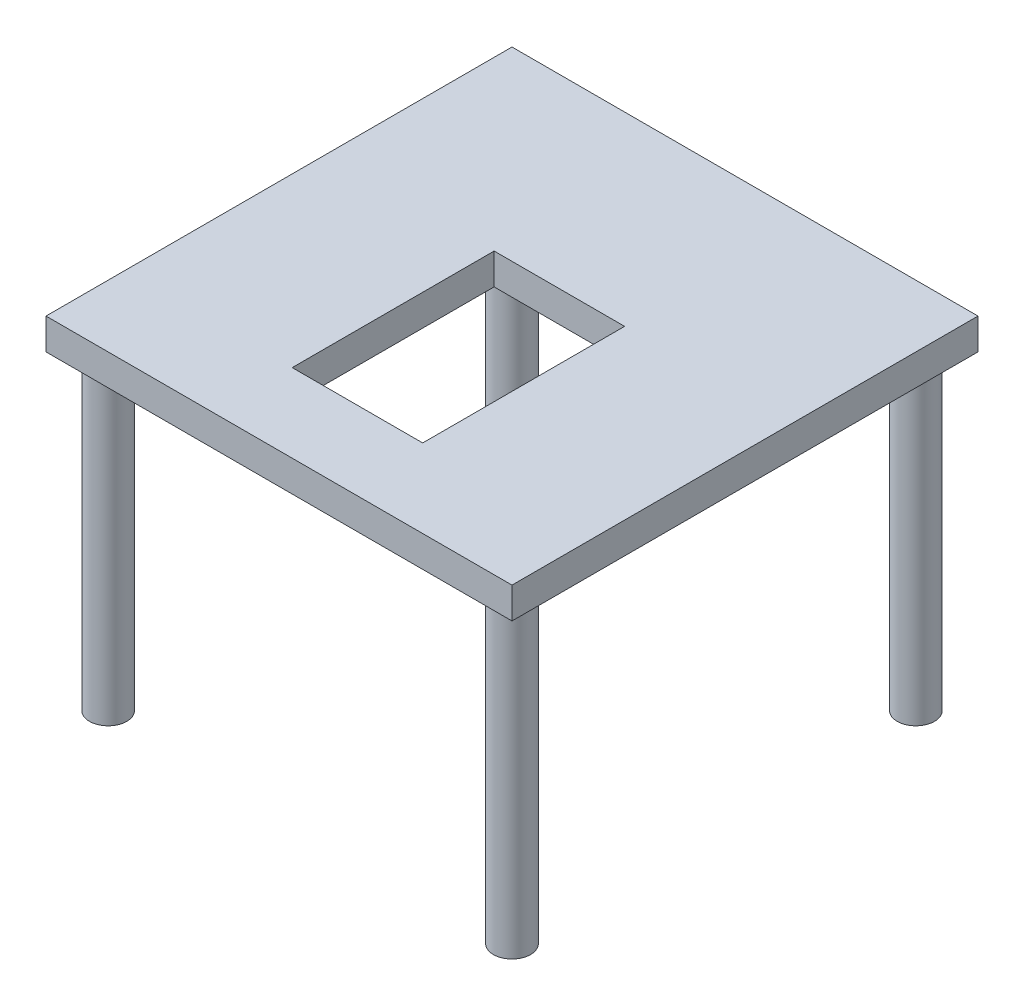
ISO-10303-21;
HEADER;
FILE_DESCRIPTION(('STEP AP214'),'2;1');
FILE_NAME('part.step','',(''),(''),'','','');
FILE_SCHEMA(('AUTOMOTIVE_DESIGN { 1 0 10303 214 1 1 1 1 }'));
ENDSEC;
DATA;
#1=APPLICATION_CONTEXT('core data for automotive mechanical design processes');
#2=APPLICATION_PROTOCOL_DEFINITION('international standard','automotive_design',2000,#1);
#3=PRODUCT_CONTEXT('',#1,'mechanical');
#4=PRODUCT('Part','Part','',(#3));
#5=PRODUCT_RELATED_PRODUCT_CATEGORY('part','',(#4));
#6=PRODUCT_DEFINITION_FORMATION('','',#4);
#7=PRODUCT_DEFINITION_CONTEXT('part definition',#1,'design');
#8=PRODUCT_DEFINITION('design','',#6,#7);
#9=PRODUCT_DEFINITION_SHAPE('','',#8);
#10=(LENGTH_UNIT() NAMED_UNIT(*) SI_UNIT(.MILLI.,.METRE.));
#11=(NAMED_UNIT(*) PLANE_ANGLE_UNIT() SI_UNIT($,.RADIAN.));
#12=(NAMED_UNIT(*) SI_UNIT($,.STERADIAN.) SOLID_ANGLE_UNIT());
#13=UNCERTAINTY_MEASURE_WITH_UNIT(LENGTH_MEASURE(1.E-05),#10,'distance_accuracy_value','');
#14=(GEOMETRIC_REPRESENTATION_CONTEXT(3) GLOBAL_UNCERTAINTY_ASSIGNED_CONTEXT((#13)) GLOBAL_UNIT_ASSIGNED_CONTEXT((#10,
#11,#12)) REPRESENTATION_CONTEXT('',''));
#15=CARTESIAN_POINT('',(0.,0.,0.));
#16=DIRECTION('',(0.,0.,1.));
#17=DIRECTION('',(1.,0.,0.));
#18=AXIS2_PLACEMENT_3D('',#15,#16,#17);
#19=CARTESIAN_POINT('',(0.,10.,75.));
#20=DIRECTION('',(0.,0.,-1.));
#21=DIRECTION('',(-1.,0.,0.));
#22=AXIS2_PLACEMENT_3D('',#19,#20,#21);
#23=PLANE('',#22);
#24=DIRECTION('',(1.,0.,0.));
#25=VECTOR('',#24,1.);
#26=CARTESIAN_POINT('',(0.,0.,75.));
#27=LINE('',#26,#25);
#28=CARTESIAN_POINT('',(-75.,0.,75.));
#29=VERTEX_POINT('',#28);
#30=CARTESIAN_POINT('',(75.,0.,75.));
#31=VERTEX_POINT('',#30);
#32=EDGE_CURVE('E150',#29,#31,#27,.T.);
#33=ORIENTED_EDGE('',*,*,#32,.T.);
#34=DIRECTION('',(0.,-1.,0.));
#35=VECTOR('',#34,1.);
#36=CARTESIAN_POINT('',(75.,10.,75.));
#37=LINE('',#36,#35);
#38=CARTESIAN_POINT('',(75.,10.,75.));
#39=VERTEX_POINT('',#38);
#40=EDGE_CURVE('E179',#39,#31,#37,.T.);
#41=ORIENTED_EDGE('',*,*,#40,.F.);
#42=DIRECTION('',(1.,0.,0.));
#43=VECTOR('',#42,1.);
#44=CARTESIAN_POINT('',(0.,10.,75.));
#45=LINE('',#44,#43);
#46=CARTESIAN_POINT('',(-75.,10.,75.));
#47=VERTEX_POINT('',#46);
#48=EDGE_CURVE('E151',#47,#39,#45,.T.);
#49=ORIENTED_EDGE('',*,*,#48,.F.);
#50=DIRECTION('',(0.,-1.,0.));
#51=VECTOR('',#50,1.);
#52=CARTESIAN_POINT('',(-75.,10.,75.));
#53=LINE('',#52,#51);
#54=EDGE_CURVE('E163',#47,#29,#53,.T.);
#55=ORIENTED_EDGE('',*,*,#54,.T.);
#56=EDGE_LOOP('',(#33,#41,#49,#55));
#57=FACE_BOUND('',#56,.T.);
#58=ADVANCED_FACE('F46',(#57),#23,.F.);
#59=CARTESIAN_POINT('',(75.,10.,0.));
#60=DIRECTION('',(-1.,0.,0.));
#61=DIRECTION('',(0.,0.,1.));
#62=AXIS2_PLACEMENT_3D('',#59,#60,#61);
#63=PLANE('',#62);
#64=DIRECTION('',(0.,0.,-1.));
#65=VECTOR('',#64,1.);
#66=CARTESIAN_POINT('',(75.,0.,0.));
#67=LINE('',#66,#65);
#68=CARTESIAN_POINT('',(75.,0.,-75.));
#69=VERTEX_POINT('',#68);
#70=EDGE_CURVE('E166',#31,#69,#67,.T.);
#71=ORIENTED_EDGE('',*,*,#70,.T.);
#72=DIRECTION('',(0.,-1.,0.));
#73=VECTOR('',#72,1.);
#74=CARTESIAN_POINT('',(75.,10.,-75.));
#75=LINE('',#74,#73);
#76=CARTESIAN_POINT('',(75.,10.,-75.));
#77=VERTEX_POINT('',#76);
#78=EDGE_CURVE('E177',#77,#69,#75,.T.);
#79=ORIENTED_EDGE('',*,*,#78,.F.);
#80=DIRECTION('',(0.,0.,-1.));
#81=VECTOR('',#80,1.);
#82=CARTESIAN_POINT('',(75.,10.,0.));
#83=LINE('',#82,#81);
#84=EDGE_CURVE('E154',#39,#77,#83,.T.);
#85=ORIENTED_EDGE('',*,*,#84,.F.);
#86=ORIENTED_EDGE('',*,*,#40,.T.);
#87=EDGE_LOOP('',(#71,#79,#85,#86));
#88=FACE_BOUND('',#87,.T.);
#89=ADVANCED_FACE('F217',(#88),#63,.F.);
#90=CARTESIAN_POINT('',(0.,10.,-75.));
#91=DIRECTION('',(0.,0.,-1.));
#92=DIRECTION('',(-1.,0.,0.));
#93=AXIS2_PLACEMENT_3D('',#90,#91,#92);
#94=PLANE('',#93);
#95=DIRECTION('',(1.,0.,0.));
#96=VECTOR('',#95,1.);
#97=CARTESIAN_POINT('',(0.,0.,-75.));
#98=LINE('',#97,#96);
#99=CARTESIAN_POINT('',(-75.,0.,-75.));
#100=VERTEX_POINT('',#99);
#101=EDGE_CURVE('E169',#100,#69,#98,.T.);
#102=ORIENTED_EDGE('',*,*,#101,.F.);
#103=DIRECTION('',(0.,-1.,0.));
#104=VECTOR('',#103,1.);
#105=CARTESIAN_POINT('',(-75.,10.,-75.));
#106=LINE('',#105,#104);
#107=CARTESIAN_POINT('',(-75.,10.,-75.));
#108=VERTEX_POINT('',#107);
#109=EDGE_CURVE('E175',#108,#100,#106,.T.);
#110=ORIENTED_EDGE('',*,*,#109,.F.);
#111=DIRECTION('',(1.,0.,0.));
#112=VECTOR('',#111,1.);
#113=CARTESIAN_POINT('',(0.,10.,-75.));
#114=LINE('',#113,#112);
#115=EDGE_CURVE('E157',#108,#77,#114,.T.);
#116=ORIENTED_EDGE('',*,*,#115,.T.);
#117=ORIENTED_EDGE('',*,*,#78,.T.);
#118=EDGE_LOOP('',(#102,#110,#116,#117));
#119=FACE_BOUND('',#118,.T.);
#120=ADVANCED_FACE('F222',(#119),#94,.T.);
#121=CARTESIAN_POINT('',(-75.,10.,0.));
#122=DIRECTION('',(-1.,0.,0.));
#123=DIRECTION('',(0.,0.,1.));
#124=AXIS2_PLACEMENT_3D('',#121,#122,#123);
#125=PLANE('',#124);
#126=DIRECTION('',(0.,0.,-1.));
#127=VECTOR('',#126,1.);
#128=CARTESIAN_POINT('',(-75.,0.,0.));
#129=LINE('',#128,#127);
#130=EDGE_CURVE('E155',#29,#100,#129,.T.);
#131=ORIENTED_EDGE('',*,*,#130,.F.);
#132=ORIENTED_EDGE('',*,*,#54,.F.);
#133=DIRECTION('',(0.,0.,-1.));
#134=VECTOR('',#133,1.);
#135=CARTESIAN_POINT('',(-75.,10.,0.));
#136=LINE('',#135,#134);
#137=EDGE_CURVE('E160',#47,#108,#136,.T.);
#138=ORIENTED_EDGE('',*,*,#137,.T.);
#139=ORIENTED_EDGE('',*,*,#109,.T.);
#140=EDGE_LOOP('',(#131,#132,#138,#139));
#141=FACE_BOUND('',#140,.T.);
#142=ADVANCED_FACE('F230',(#141),#125,.T.);
#143=CARTESIAN_POINT('',(0.,10.,0.));
#144=DIRECTION('',(0.,1.,0.));
#145=DIRECTION('',(0.,0.,1.));
#146=AXIS2_PLACEMENT_3D('',#143,#144,#145);
#147=PLANE('',#146);
#148=DIRECTION('',(1.,0.,0.));
#149=VECTOR('',#148,1.);
#150=CARTESIAN_POINT('',(0.,10.,49.75));
#151=LINE('',#150,#149);
#152=CARTESIAN_POINT('',(-21.,10.,49.75));
#153=VERTEX_POINT('',#152);
#154=CARTESIAN_POINT('',(21.,10.,49.75));
#155=VERTEX_POINT('',#154);
#156=EDGE_CURVE('E60',#153,#155,#151,.T.);
#157=ORIENTED_EDGE('',*,*,#156,.F.);
#158=DIRECTION('',(0.,0.,-1.));
#159=VECTOR('',#158,1.);
#160=CARTESIAN_POINT('',(-21.,10.,0.));
#161=LINE('',#160,#159);
#162=CARTESIAN_POINT('',(-21.,10.,-15.25));
#163=VERTEX_POINT('',#162);
#164=EDGE_CURVE('E129',#153,#163,#161,.T.);
#165=ORIENTED_EDGE('',*,*,#164,.T.);
#166=DIRECTION('',(1.,0.,0.));
#167=VECTOR('',#166,1.);
#168=CARTESIAN_POINT('',(0.,10.,-15.25));
#169=LINE('',#168,#167);
#170=CARTESIAN_POINT('',(21.,10.,-15.25));
#171=VERTEX_POINT('',#170);
#172=EDGE_CURVE('E113',#163,#171,#169,.T.);
#173=ORIENTED_EDGE('',*,*,#172,.T.);
#174=DIRECTION('',(0.,0.,-1.));
#175=VECTOR('',#174,1.);
#176=CARTESIAN_POINT('',(21.,10.,0.));
#177=LINE('',#176,#175);
#178=EDGE_CURVE('E122',#155,#171,#177,.T.);
#179=ORIENTED_EDGE('',*,*,#178,.F.);
#180=EDGE_LOOP('',(#157,#165,#173,#179));
#181=FACE_BOUND('',#180,.T.);
#182=ORIENTED_EDGE('',*,*,#48,.T.);
#183=ORIENTED_EDGE('',*,*,#84,.T.);
#184=ORIENTED_EDGE('',*,*,#115,.F.);
#185=ORIENTED_EDGE('',*,*,#137,.F.);
#186=EDGE_LOOP('',(#182,#183,#184,#185));
#187=FACE_BOUND('',#186,.T.);
#188=ADVANCED_FACE('F126',(#181,#187),#147,.T.);
#189=CARTESIAN_POINT('',(0.,0.,0.));
#190=DIRECTION('',(0.,1.,0.));
#191=DIRECTION('',(0.,0.,1.));
#192=AXIS2_PLACEMENT_3D('',#189,#190,#191);
#193=PLANE('',#192);
#194=DIRECTION('',(0.,0.,-1.));
#195=VECTOR('',#194,1.);
#196=CARTESIAN_POINT('',(-21.,0.,0.));
#197=LINE('',#196,#195);
#198=CARTESIAN_POINT('',(-21.,0.,49.75));
#199=VERTEX_POINT('',#198);
#200=CARTESIAN_POINT('',(-21.,0.,-15.25));
#201=VERTEX_POINT('',#200);
#202=EDGE_CURVE('E53',#199,#201,#197,.T.);
#203=ORIENTED_EDGE('',*,*,#202,.F.);
#204=DIRECTION('',(1.,0.,0.));
#205=VECTOR('',#204,1.);
#206=CARTESIAN_POINT('',(0.,0.,49.75));
#207=LINE('',#206,#205);
#208=CARTESIAN_POINT('',(21.,0.,49.75));
#209=VERTEX_POINT('',#208);
#210=EDGE_CURVE('E13',#199,#209,#207,.T.);
#211=ORIENTED_EDGE('',*,*,#210,.T.);
#212=DIRECTION('',(0.,0.,-1.));
#213=VECTOR('',#212,1.);
#214=CARTESIAN_POINT('',(21.,0.,0.));
#215=LINE('',#214,#213);
#216=CARTESIAN_POINT('',(21.,0.,-15.25));
#217=VERTEX_POINT('',#216);
#218=EDGE_CURVE('E194',#209,#217,#215,.T.);
#219=ORIENTED_EDGE('',*,*,#218,.T.);
#220=DIRECTION('',(1.,0.,0.));
#221=VECTOR('',#220,1.);
#222=CARTESIAN_POINT('',(0.,0.,-15.25));
#223=LINE('',#222,#221);
#224=EDGE_CURVE('E116',#201,#217,#223,.T.);
#225=ORIENTED_EDGE('',*,*,#224,.F.);
#226=EDGE_LOOP('',(#203,#211,#219,#225));
#227=FACE_BOUND('',#226,.T.);
#228=CARTESIAN_POINT('',(65.,0.,-65.));
#229=DIRECTION('',(0.,1.,0.));
#230=DIRECTION('',(0.,0.,1.));
#231=AXIS2_PLACEMENT_3D('',#228,#229,#230);
#232=CIRCLE('',#231,6.);
#233=CARTESIAN_POINT('',(65.,0.,-59.));
#234=VERTEX_POINT('',#233);
#235=EDGE_CURVE('E191',#234,#234,#232,.F.);
#236=ORIENTED_EDGE('',*,*,#235,.F.);
#237=EDGE_LOOP('',(#236));
#238=FACE_BOUND('',#237,.T.);
#239=CARTESIAN_POINT('',(-65.,0.,-65.));
#240=DIRECTION('',(0.,1.,0.));
#241=DIRECTION('',(0.,0.,1.));
#242=AXIS2_PLACEMENT_3D('',#239,#240,#241);
#243=CIRCLE('',#242,6.);
#244=CARTESIAN_POINT('',(-65.,0.,-59.));
#245=VERTEX_POINT('',#244);
#246=EDGE_CURVE('E188',#245,#245,#243,.F.);
#247=ORIENTED_EDGE('',*,*,#246,.F.);
#248=EDGE_LOOP('',(#247));
#249=FACE_BOUND('',#248,.T.);
#250=CARTESIAN_POINT('',(-65.,0.,65.));
#251=DIRECTION('',(0.,1.,0.));
#252=DIRECTION('',(0.,0.,1.));
#253=AXIS2_PLACEMENT_3D('',#250,#251,#252);
#254=CIRCLE('',#253,6.);
#255=CARTESIAN_POINT('',(-65.,0.,71.));
#256=VERTEX_POINT('',#255);
#257=EDGE_CURVE('E185',#256,#256,#254,.F.);
#258=ORIENTED_EDGE('',*,*,#257,.F.);
#259=EDGE_LOOP('',(#258));
#260=FACE_BOUND('',#259,.T.);
#261=CARTESIAN_POINT('',(65.,0.,65.));
#262=DIRECTION('',(0.,1.,0.));
#263=DIRECTION('',(0.,0.,1.));
#264=AXIS2_PLACEMENT_3D('',#261,#262,#263);
#265=CIRCLE('',#264,6.);
#266=CARTESIAN_POINT('',(65.,0.,71.));
#267=VERTEX_POINT('',#266);
#268=EDGE_CURVE('E182',#267,#267,#265,.F.);
#269=ORIENTED_EDGE('',*,*,#268,.F.);
#270=EDGE_LOOP('',(#269));
#271=FACE_BOUND('',#270,.T.);
#272=ORIENTED_EDGE('',*,*,#32,.F.);
#273=ORIENTED_EDGE('',*,*,#130,.T.);
#274=ORIENTED_EDGE('',*,*,#101,.T.);
#275=ORIENTED_EDGE('',*,*,#70,.F.);
#276=EDGE_LOOP('',(#272,#273,#274,#275));
#277=FACE_BOUND('',#276,.T.);
#278=ADVANCED_FACE('F201',(#227,#238,#249,#260,#271,#277),#193,.F.);
#279=CARTESIAN_POINT('',(65.,-100.,65.));
#280=DIRECTION('',(0.,1.,0.));
#281=DIRECTION('',(0.,0.,1.));
#282=AXIS2_PLACEMENT_3D('',#279,#280,#281);
#283=CYLINDRICAL_SURFACE('',#282,6.);
#284=CARTESIAN_POINT('',(65.,-100.,65.));
#285=DIRECTION('',(0.,-1.,0.));
#286=DIRECTION('',(0.,0.,-1.));
#287=AXIS2_PLACEMENT_3D('',#284,#285,#286);
#288=CIRCLE('',#287,6.);
#289=CARTESIAN_POINT('',(65.,-100.,59.));
#290=VERTEX_POINT('',#289);
#291=EDGE_CURVE('E147',#290,#290,#288,.T.);
#292=ORIENTED_EDGE('',*,*,#291,.F.);
#293=EDGE_LOOP('',(#292));
#294=FACE_BOUND('',#293,.T.);
#295=ORIENTED_EDGE('',*,*,#268,.T.);
#296=EDGE_LOOP('',(#295));
#297=FACE_BOUND('',#296,.T.);
#298=ADVANCED_FACE('F242',(#294,#297),#283,.T.);
#299=CARTESIAN_POINT('',(0.,-100.,0.));
#300=DIRECTION('',(0.,-1.,0.));
#301=DIRECTION('',(0.,0.,-1.));
#302=AXIS2_PLACEMENT_3D('',#299,#300,#301);
#303=PLANE('',#302);
#304=ORIENTED_EDGE('',*,*,#291,.T.);
#305=EDGE_LOOP('',(#304));
#306=FACE_BOUND('',#305,.T.);
#307=ADVANCED_FACE('F267',(#306),#303,.T.);
#308=CARTESIAN_POINT('',(-65.,-100.,65.));
#309=DIRECTION('',(0.,1.,0.));
#310=DIRECTION('',(0.,0.,1.));
#311=AXIS2_PLACEMENT_3D('',#308,#309,#310);
#312=CYLINDRICAL_SURFACE('',#311,6.);
#313=CARTESIAN_POINT('',(-65.,-100.,65.));
#314=DIRECTION('',(0.,-1.,0.));
#315=DIRECTION('',(0.,0.,-1.));
#316=AXIS2_PLACEMENT_3D('',#313,#314,#315);
#317=CIRCLE('',#316,6.);
#318=CARTESIAN_POINT('',(-65.,-100.,59.));
#319=VERTEX_POINT('',#318);
#320=EDGE_CURVE('E144',#319,#319,#317,.T.);
#321=ORIENTED_EDGE('',*,*,#320,.F.);
#322=EDGE_LOOP('',(#321));
#323=FACE_BOUND('',#322,.T.);
#324=ORIENTED_EDGE('',*,*,#257,.T.);
#325=EDGE_LOOP('',(#324));
#326=FACE_BOUND('',#325,.T.);
#327=ADVANCED_FACE('F278',(#323,#326),#312,.T.);
#328=CARTESIAN_POINT('',(0.,-100.,0.));
#329=DIRECTION('',(0.,-1.,0.));
#330=DIRECTION('',(0.,0.,-1.));
#331=AXIS2_PLACEMENT_3D('',#328,#329,#330);
#332=PLANE('',#331);
#333=ORIENTED_EDGE('',*,*,#320,.T.);
#334=EDGE_LOOP('',(#333));
#335=FACE_BOUND('',#334,.T.);
#336=ADVANCED_FACE('F287',(#335),#332,.T.);
#337=CARTESIAN_POINT('',(-65.,-100.,-65.));
#338=DIRECTION('',(0.,1.,0.));
#339=DIRECTION('',(0.,0.,1.));
#340=AXIS2_PLACEMENT_3D('',#337,#338,#339);
#341=CYLINDRICAL_SURFACE('',#340,6.);
#342=CARTESIAN_POINT('',(-65.,-100.,-65.));
#343=DIRECTION('',(0.,-1.,0.));
#344=DIRECTION('',(0.,0.,-1.));
#345=AXIS2_PLACEMENT_3D('',#342,#343,#344);
#346=CIRCLE('',#345,6.);
#347=CARTESIAN_POINT('',(-65.,-100.,-71.));
#348=VERTEX_POINT('',#347);
#349=EDGE_CURVE('E141',#348,#348,#346,.T.);
#350=ORIENTED_EDGE('',*,*,#349,.F.);
#351=EDGE_LOOP('',(#350));
#352=FACE_BOUND('',#351,.T.);
#353=ORIENTED_EDGE('',*,*,#246,.T.);
#354=EDGE_LOOP('',(#353));
#355=FACE_BOUND('',#354,.T.);
#356=ADVANCED_FACE('F298',(#352,#355),#341,.T.);
#357=CARTESIAN_POINT('',(0.,-100.,0.));
#358=DIRECTION('',(0.,-1.,0.));
#359=DIRECTION('',(0.,0.,-1.));
#360=AXIS2_PLACEMENT_3D('',#357,#358,#359);
#361=PLANE('',#360);
#362=ORIENTED_EDGE('',*,*,#349,.T.);
#363=EDGE_LOOP('',(#362));
#364=FACE_BOUND('',#363,.T.);
#365=ADVANCED_FACE('F308',(#364),#361,.T.);
#366=CARTESIAN_POINT('',(65.,-100.,-65.));
#367=DIRECTION('',(0.,1.,0.));
#368=DIRECTION('',(0.,0.,1.));
#369=AXIS2_PLACEMENT_3D('',#366,#367,#368);
#370=CYLINDRICAL_SURFACE('',#369,6.);
#371=CARTESIAN_POINT('',(65.,-100.,-65.));
#372=DIRECTION('',(0.,-1.,0.));
#373=DIRECTION('',(0.,0.,-1.));
#374=AXIS2_PLACEMENT_3D('',#371,#372,#373);
#375=CIRCLE('',#374,6.);
#376=CARTESIAN_POINT('',(65.,-100.,-71.));
#377=VERTEX_POINT('',#376);
#378=EDGE_CURVE('E136',#377,#377,#375,.T.);
#379=ORIENTED_EDGE('',*,*,#378,.F.);
#380=EDGE_LOOP('',(#379));
#381=FACE_BOUND('',#380,.T.);
#382=ORIENTED_EDGE('',*,*,#235,.T.);
#383=EDGE_LOOP('',(#382));
#384=FACE_BOUND('',#383,.T.);
#385=ADVANCED_FACE('F212',(#381,#384),#370,.T.);
#386=CARTESIAN_POINT('',(0.,-100.,0.));
#387=DIRECTION('',(0.,-1.,0.));
#388=DIRECTION('',(0.,0.,-1.));
#389=AXIS2_PLACEMENT_3D('',#386,#387,#388);
#390=PLANE('',#389);
#391=ORIENTED_EDGE('',*,*,#378,.T.);
#392=EDGE_LOOP('',(#391));
#393=FACE_BOUND('',#392,.T.);
#394=ADVANCED_FACE('F205',(#393),#390,.T.);
#395=CARTESIAN_POINT('',(0.,-100.,49.75));
#396=DIRECTION('',(0.,0.,1.));
#397=DIRECTION('',(1.,0.,0.));
#398=AXIS2_PLACEMENT_3D('',#395,#396,#397);
#399=PLANE('',#398);
#400=DIRECTION('',(0.,1.,0.));
#401=VECTOR('',#400,1.);
#402=CARTESIAN_POINT('',(-21.,-100.,49.75));
#403=LINE('',#402,#401);
#404=EDGE_CURVE('E134',#199,#153,#403,.T.);
#405=ORIENTED_EDGE('',*,*,#404,.T.);
#406=ORIENTED_EDGE('',*,*,#156,.T.);
#407=DIRECTION('',(0.,1.,0.));
#408=VECTOR('',#407,1.);
#409=CARTESIAN_POINT('',(21.,-100.,49.75));
#410=LINE('',#409,#408);
#411=EDGE_CURVE('E119',#209,#155,#410,.T.);
#412=ORIENTED_EDGE('',*,*,#411,.F.);
#413=ORIENTED_EDGE('',*,*,#210,.F.);
#414=EDGE_LOOP('',(#405,#406,#412,#413));
#415=FACE_BOUND('',#414,.T.);
#416=ADVANCED_FACE('F203',(#415),#399,.F.);
#417=CARTESIAN_POINT('',(-21.,-100.,0.));
#418=DIRECTION('',(1.,0.,0.));
#419=DIRECTION('',(0.,0.,-1.));
#420=AXIS2_PLACEMENT_3D('',#417,#418,#419);
#421=PLANE('',#420);
#422=ORIENTED_EDGE('',*,*,#202,.T.);
#423=DIRECTION('',(0.,1.,0.));
#424=VECTOR('',#423,1.);
#425=CARTESIAN_POINT('',(-21.,-100.,-15.25));
#426=LINE('',#425,#424);
#427=EDGE_CURVE('E118',#201,#163,#426,.T.);
#428=ORIENTED_EDGE('',*,*,#427,.T.);
#429=ORIENTED_EDGE('',*,*,#164,.F.);
#430=ORIENTED_EDGE('',*,*,#404,.F.);
#431=EDGE_LOOP('',(#422,#428,#429,#430));
#432=FACE_BOUND('',#431,.T.);
#433=ADVANCED_FACE('F199',(#432),#421,.T.);
#434=CARTESIAN_POINT('',(0.,-100.,-15.25));
#435=DIRECTION('',(0.,0.,1.));
#436=DIRECTION('',(1.,0.,0.));
#437=AXIS2_PLACEMENT_3D('',#434,#435,#436);
#438=PLANE('',#437);
#439=ORIENTED_EDGE('',*,*,#224,.T.);
#440=DIRECTION('',(0.,1.,0.));
#441=VECTOR('',#440,1.);
#442=CARTESIAN_POINT('',(21.,-100.,-15.25));
#443=LINE('',#442,#441);
#444=EDGE_CURVE('E68',#217,#171,#443,.T.);
#445=ORIENTED_EDGE('',*,*,#444,.T.);
#446=ORIENTED_EDGE('',*,*,#172,.F.);
#447=ORIENTED_EDGE('',*,*,#427,.F.);
#448=EDGE_LOOP('',(#439,#445,#446,#447));
#449=FACE_BOUND('',#448,.T.);
#450=ADVANCED_FACE('F110',(#449),#438,.T.);
#451=CARTESIAN_POINT('',(21.,-100.,0.));
#452=DIRECTION('',(1.,0.,0.));
#453=DIRECTION('',(0.,0.,-1.));
#454=AXIS2_PLACEMENT_3D('',#451,#452,#453);
#455=PLANE('',#454);
#456=ORIENTED_EDGE('',*,*,#411,.T.);
#457=ORIENTED_EDGE('',*,*,#178,.T.);
#458=ORIENTED_EDGE('',*,*,#444,.F.);
#459=ORIENTED_EDGE('',*,*,#218,.F.);
#460=EDGE_LOOP('',(#456,#457,#458,#459));
#461=FACE_BOUND('',#460,.T.);
#462=ADVANCED_FACE('F123',(#461),#455,.F.);
#463=CLOSED_SHELL('',(#58,#89,#120,#142,#188,#278,#298,#307,#327,#336,#356,#365,#385,#394,#416,
#433,#450,#462));
#464=MANIFOLD_SOLID_BREP('B2',#463);
#465=ADVANCED_BREP_SHAPE_REPRESENTATION('',(#18,#464),#14);
#466=SHAPE_DEFINITION_REPRESENTATION(#9,#465);
ENDSEC;
END-ISO-10303-21;
